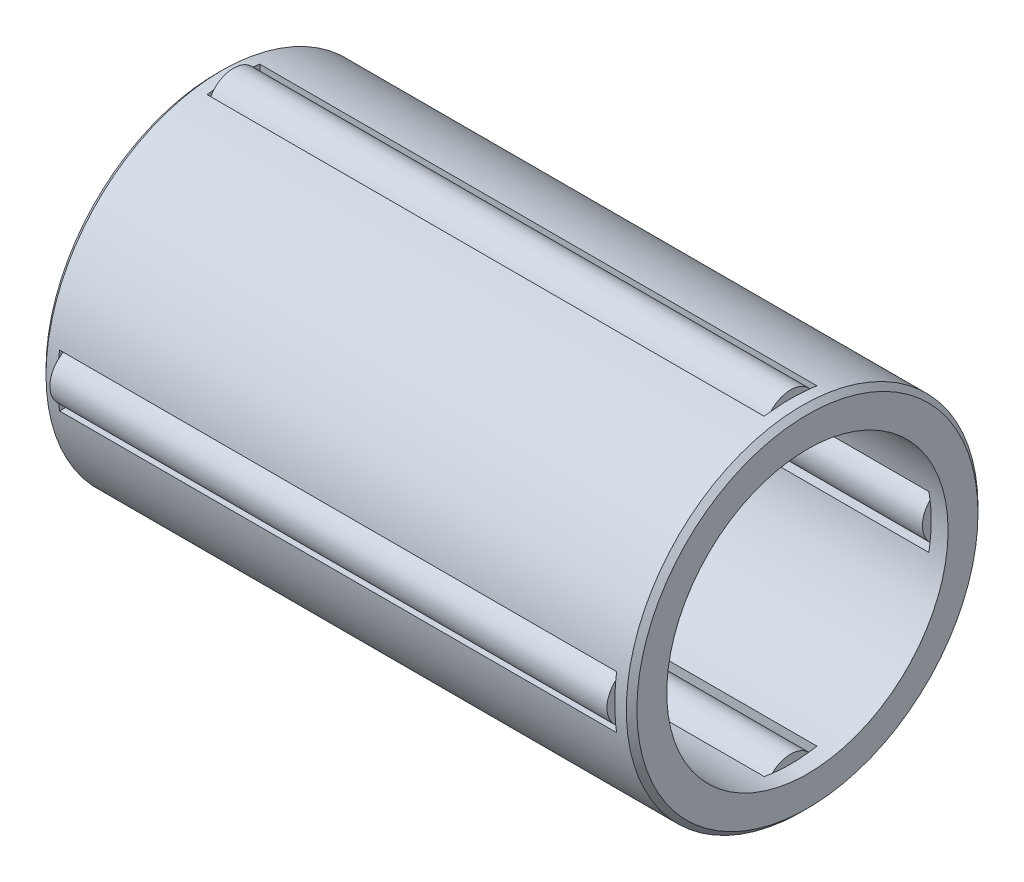
ISO-10303-21;
HEADER;
FILE_DESCRIPTION(('STEP AP214'),'2;1');
FILE_NAME('part.step','',(''),(''),'','','');
FILE_SCHEMA(('AUTOMOTIVE_DESIGN { 1 0 10303 214 1 1 1 1 }'));
ENDSEC;
DATA;
#1=APPLICATION_CONTEXT('core data for automotive mechanical design processes');
#2=APPLICATION_PROTOCOL_DEFINITION('international standard','automotive_design',2000,#1);
#3=PRODUCT_CONTEXT('',#1,'mechanical');
#4=PRODUCT('Part','Part','',(#3));
#5=PRODUCT_RELATED_PRODUCT_CATEGORY('part','',(#4));
#6=PRODUCT_DEFINITION_FORMATION('','',#4);
#7=PRODUCT_DEFINITION_CONTEXT('part definition',#1,'design');
#8=PRODUCT_DEFINITION('design','',#6,#7);
#9=PRODUCT_DEFINITION_SHAPE('','',#8);
#10=(LENGTH_UNIT() NAMED_UNIT(*) SI_UNIT(.MILLI.,.METRE.));
#11=(NAMED_UNIT(*) PLANE_ANGLE_UNIT() SI_UNIT($,.RADIAN.));
#12=(NAMED_UNIT(*) SI_UNIT($,.STERADIAN.) SOLID_ANGLE_UNIT());
#13=UNCERTAINTY_MEASURE_WITH_UNIT(LENGTH_MEASURE(1.E-05),#10,'distance_accuracy_value','');
#14=(GEOMETRIC_REPRESENTATION_CONTEXT(3) GLOBAL_UNCERTAINTY_ASSIGNED_CONTEXT((#13)) GLOBAL_UNIT_ASSIGNED_CONTEXT((#10,
#11,#12)) REPRESENTATION_CONTEXT('',''));
#15=CARTESIAN_POINT('',(0.,0.,0.));
#16=DIRECTION('',(0.,0.,1.));
#17=DIRECTION('',(1.,0.,0.));
#18=AXIS2_PLACEMENT_3D('',#15,#16,#17);
#19=CARTESIAN_POINT('',(1.6,13.33335,0.));
#20=DIRECTION('',(1.,0.,0.));
#21=DIRECTION('',(0.,0.,-1.));
#22=AXIS2_PLACEMENT_3D('',#19,#20,#21);
#23=PLANE('',#22);
#24=CARTESIAN_POINT('',(1.6,0.,0.));
#25=DIRECTION('',(1.,0.,0.));
#26=DIRECTION('',(0.,0.,-1.));
#27=AXIS2_PLACEMENT_3D('',#24,#25,#26);
#28=CIRCLE('',#27,16.66665);
#29=CARTESIAN_POINT('',(1.6,-2.5,-16.4780830870129));
#30=VERTEX_POINT('',#29);
#31=CARTESIAN_POINT('',(1.6,-1.84283291133947,-16.5644555927258));
#32=VERTEX_POINT('',#31);
#33=EDGE_CURVE('E264',#30,#32,#28,.T.);
#34=ORIENTED_EDGE('',*,*,#33,.T.);
#35=CARTESIAN_POINT('',(1.6,1.56592938047115E-13,-14.95));
#36=DIRECTION('',(1.,0.,0.));
#37=DIRECTION('',(0.,-1.,0.));
#38=AXIS2_PLACEMENT_3D('',#35,#36,#37);
#39=CIRCLE('',#38,2.45);
#40=CARTESIAN_POINT('',(1.6,-1.7348272868859,-13.2200074321907));
#41=VERTEX_POINT('',#40);
#42=EDGE_CURVE('E242',#41,#32,#39,.T.);
#43=ORIENTED_EDGE('',*,*,#42,.F.);
#44=CARTESIAN_POINT('',(1.6,0.,0.));
#45=DIRECTION('',(1.,0.,0.));
#46=DIRECTION('',(0.,0.,-1.));
#47=AXIS2_PLACEMENT_3D('',#44,#45,#46);
#48=CIRCLE('',#47,13.33335);
#49=CARTESIAN_POINT('',(1.6,-2.5,-13.0968783388447));
#50=VERTEX_POINT('',#49);
#51=EDGE_CURVE('E308',#50,#41,#48,.T.);
#52=ORIENTED_EDGE('',*,*,#51,.F.);
#53=DIRECTION('',(0.,0.,1.));
#54=VECTOR('',#53,1.);
#55=CARTESIAN_POINT('',(1.6,-2.5,-13.0968783388447));
#56=LINE('',#55,#54);
#57=EDGE_CURVE('E272',#30,#50,#56,.T.);
#58=ORIENTED_EDGE('',*,*,#57,.F.);
#59=EDGE_LOOP('',(#34,#43,#52,#58));
#60=FACE_BOUND('',#59,.T.);
#61=ADVANCED_FACE('F33',(#60),#23,.T.);
#62=CARTESIAN_POINT('',(54.4,0.,0.));
#63=DIRECTION('',(1.,0.,0.));
#64=DIRECTION('',(0.,0.,-1.));
#65=AXIS2_PLACEMENT_3D('',#62,#63,#64);
#66=PLANE('',#65);
#67=CARTESIAN_POINT('',(54.4,1.56592938047115E-13,-14.95));
#68=DIRECTION('',(1.,0.,0.));
#69=DIRECTION('',(0.,0.,-1.));
#70=AXIS2_PLACEMENT_3D('',#67,#68,#69);
#71=CIRCLE('',#70,2.45);
#72=CARTESIAN_POINT('',(54.4,-1.84283291133948,-16.5644555927258));
#73=VERTEX_POINT('',#72);
#74=CARTESIAN_POINT('',(54.4,-1.7348272868859,-13.2200074321907));
#75=VERTEX_POINT('',#74);
#76=EDGE_CURVE('E56',#73,#75,#71,.F.);
#77=ORIENTED_EDGE('',*,*,#76,.F.);
#78=CARTESIAN_POINT('',(54.4,0.,0.));
#79=DIRECTION('',(-1.,0.,0.));
#80=DIRECTION('',(0.,0.,-1.));
#81=AXIS2_PLACEMENT_3D('',#78,#79,#80);
#82=CIRCLE('',#81,16.66665);
#83=CARTESIAN_POINT('',(54.4,-2.5,-16.4780830870129));
#84=VERTEX_POINT('',#83);
#85=EDGE_CURVE('E513',#73,#84,#82,.T.);
#86=ORIENTED_EDGE('',*,*,#85,.T.);
#87=DIRECTION('',(0.,0.,1.));
#88=VECTOR('',#87,1.);
#89=CARTESIAN_POINT('',(54.4,-2.5,-13.0968783388447));
#90=LINE('',#89,#88);
#91=CARTESIAN_POINT('',(54.4,-2.5,-13.0968783388447));
#92=VERTEX_POINT('',#91);
#93=EDGE_CURVE('E1062',#84,#92,#90,.T.);
#94=ORIENTED_EDGE('',*,*,#93,.T.);
#95=CARTESIAN_POINT('',(54.4,0.,0.));
#96=DIRECTION('',(-1.,0.,0.));
#97=DIRECTION('',(0.,0.,-1.));
#98=AXIS2_PLACEMENT_3D('',#95,#96,#97);
#99=CIRCLE('',#98,13.33335);
#100=EDGE_CURVE('E531',#75,#92,#99,.T.);
#101=ORIENTED_EDGE('',*,*,#100,.F.);
#102=EDGE_LOOP('',(#77,#86,#94,#101));
#103=FACE_BOUND('',#102,.T.);
#104=ADVANCED_FACE('F558',(#103),#66,.F.);
#105=CARTESIAN_POINT('',(1.6,-16.4780830870129,2.5));
#106=VERTEX_POINT('',#105);
#107=CARTESIAN_POINT('',(1.6,-16.5644555927258,1.84283291133965));
#108=VERTEX_POINT('',#107);
#109=EDGE_CURVE('E275',#106,#108,#28,.T.);
#110=ORIENTED_EDGE('',*,*,#109,.T.);
#111=CARTESIAN_POINT('',(1.6,-14.95,0.));
#112=DIRECTION('',(1.,0.,0.));
#113=DIRECTION('',(0.,0.,1.));
#114=AXIS2_PLACEMENT_3D('',#111,#112,#113);
#115=CIRCLE('',#114,2.45);
#116=CARTESIAN_POINT('',(1.6,-13.2200074321906,1.73482728688604));
#117=VERTEX_POINT('',#116);
#118=EDGE_CURVE('E267',#117,#108,#115,.T.);
#119=ORIENTED_EDGE('',*,*,#118,.F.);
#120=CARTESIAN_POINT('',(1.6,-13.0968783388447,2.5));
#121=VERTEX_POINT('',#120);
#122=EDGE_CURVE('E317',#121,#117,#48,.T.);
#123=ORIENTED_EDGE('',*,*,#122,.F.);
#124=DIRECTION('',(0.,1.,0.));
#125=VECTOR('',#124,1.);
#126=CARTESIAN_POINT('',(1.6,-13.0968783388447,2.5));
#127=LINE('',#126,#125);
#128=EDGE_CURVE('E650',#106,#121,#127,.T.);
#129=ORIENTED_EDGE('',*,*,#128,.F.);
#130=EDGE_LOOP('',(#110,#119,#123,#129));
#131=FACE_BOUND('',#130,.T.);
#132=ADVANCED_FACE('F560',(#131),#23,.T.);
#133=CARTESIAN_POINT('',(54.4,-14.95,0.));
#134=DIRECTION('',(1.,0.,0.));
#135=DIRECTION('',(0.,0.,-1.));
#136=AXIS2_PLACEMENT_3D('',#133,#134,#135);
#137=CIRCLE('',#136,2.45);
#138=CARTESIAN_POINT('',(54.4,-16.5644555927258,1.84283291133965));
#139=VERTEX_POINT('',#138);
#140=CARTESIAN_POINT('',(54.4,-13.2200074321906,1.73482728688603));
#141=VERTEX_POINT('',#140);
#142=EDGE_CURVE('E410',#139,#141,#137,.F.);
#143=ORIENTED_EDGE('',*,*,#142,.F.);
#144=CARTESIAN_POINT('',(54.4,-16.4780830870129,2.5));
#145=VERTEX_POINT('',#144);
#146=EDGE_CURVE('E446',#139,#145,#82,.T.);
#147=ORIENTED_EDGE('',*,*,#146,.T.);
#148=DIRECTION('',(0.,1.,0.));
#149=VECTOR('',#148,1.);
#150=CARTESIAN_POINT('',(54.4,-13.0968783388447,2.5));
#151=LINE('',#150,#149);
#152=CARTESIAN_POINT('',(54.4,-13.0968783388447,2.5));
#153=VERTEX_POINT('',#152);
#154=EDGE_CURVE('E642',#145,#153,#151,.T.);
#155=ORIENTED_EDGE('',*,*,#154,.T.);
#156=EDGE_CURVE('E536',#141,#153,#99,.T.);
#157=ORIENTED_EDGE('',*,*,#156,.F.);
#158=EDGE_LOOP('',(#143,#147,#155,#157));
#159=FACE_BOUND('',#158,.T.);
#160=ADVANCED_FACE('F565',(#159),#66,.F.);
#161=CARTESIAN_POINT('',(1.6,-1.73482728688608,13.2200074321906));
#162=VERTEX_POINT('',#161);
#163=CARTESIAN_POINT('',(1.6,-2.5,13.0968783388447));
#164=VERTEX_POINT('',#163);
#165=EDGE_CURVE('E312',#162,#164,#48,.T.);
#166=ORIENTED_EDGE('',*,*,#165,.F.);
#167=CARTESIAN_POINT('',(1.6,0.,14.95));
#168=DIRECTION('',(1.,0.,0.));
#169=DIRECTION('',(0.,1.,0.));
#170=AXIS2_PLACEMENT_3D('',#167,#168,#169);
#171=CIRCLE('',#170,2.45);
#172=CARTESIAN_POINT('',(1.6,-1.8428329113397,16.5644555927257));
#173=VERTEX_POINT('',#172);
#174=EDGE_CURVE('E613',#173,#162,#171,.T.);
#175=ORIENTED_EDGE('',*,*,#174,.F.);
#176=CARTESIAN_POINT('',(1.6,-2.5,16.4780830870129));
#177=VERTEX_POINT('',#176);
#178=EDGE_CURVE('E277',#173,#177,#28,.T.);
#179=ORIENTED_EDGE('',*,*,#178,.T.);
#180=DIRECTION('',(0.,0.,1.));
#181=VECTOR('',#180,1.);
#182=CARTESIAN_POINT('',(1.6,-2.5,16.4780830870129));
#183=LINE('',#182,#181);
#184=EDGE_CURVE('E646',#164,#177,#183,.T.);
#185=ORIENTED_EDGE('',*,*,#184,.F.);
#186=EDGE_LOOP('',(#166,#175,#179,#185));
#187=FACE_BOUND('',#186,.T.);
#188=ADVANCED_FACE('F570',(#187),#23,.T.);
#189=CARTESIAN_POINT('',(54.4,0.,14.95));
#190=DIRECTION('',(1.,0.,0.));
#191=DIRECTION('',(0.,0.,-1.));
#192=AXIS2_PLACEMENT_3D('',#189,#190,#191);
#193=CIRCLE('',#192,2.45);
#194=CARTESIAN_POINT('',(54.4,-1.73482728688608,13.2200074321906));
#195=VERTEX_POINT('',#194);
#196=CARTESIAN_POINT('',(54.4,-1.84283291133971,16.5644555927257));
#197=VERTEX_POINT('',#196);
#198=EDGE_CURVE('E402',#195,#197,#193,.F.);
#199=ORIENTED_EDGE('',*,*,#198,.F.);
#200=CARTESIAN_POINT('',(54.4,-2.5,13.0968783388447));
#201=VERTEX_POINT('',#200);
#202=EDGE_CURVE('E388',#201,#195,#99,.T.);
#203=ORIENTED_EDGE('',*,*,#202,.F.);
#204=DIRECTION('',(0.,0.,1.));
#205=VECTOR('',#204,1.);
#206=CARTESIAN_POINT('',(54.4,-2.5,16.4780830870129));
#207=LINE('',#206,#205);
#208=CARTESIAN_POINT('',(54.4,-2.5,16.4780830870129));
#209=VERTEX_POINT('',#208);
#210=EDGE_CURVE('E639',#201,#209,#207,.T.);
#211=ORIENTED_EDGE('',*,*,#210,.T.);
#212=EDGE_CURVE('E493',#209,#197,#82,.T.);
#213=ORIENTED_EDGE('',*,*,#212,.T.);
#214=EDGE_LOOP('',(#199,#203,#211,#213));
#215=FACE_BOUND('',#214,.T.);
#216=ADVANCED_FACE('F638',(#215),#66,.F.);
#217=CARTESIAN_POINT('',(1.6,13.2200074321906,1.73482728688604));
#218=VERTEX_POINT('',#217);
#219=CARTESIAN_POINT('',(1.6,13.0968783388447,2.5));
#220=VERTEX_POINT('',#219);
#221=EDGE_CURVE('E298',#218,#220,#48,.T.);
#222=ORIENTED_EDGE('',*,*,#221,.F.);
#223=CARTESIAN_POINT('',(1.6,14.95,0.));
#224=DIRECTION('',(1.,0.,0.));
#225=DIRECTION('',(0.,0.,-1.));
#226=AXIS2_PLACEMENT_3D('',#223,#224,#225);
#227=CIRCLE('',#226,2.45);
#228=CARTESIAN_POINT('',(1.6,16.5644555927258,1.84283291133965));
#229=VERTEX_POINT('',#228);
#230=EDGE_CURVE('E355',#229,#218,#227,.T.);
#231=ORIENTED_EDGE('',*,*,#230,.F.);
#232=CARTESIAN_POINT('',(1.6,16.4780830870129,2.5));
#233=VERTEX_POINT('',#232);
#234=EDGE_CURVE('E276',#229,#233,#28,.T.);
#235=ORIENTED_EDGE('',*,*,#234,.T.);
#236=DIRECTION('',(0.,1.,0.));
#237=VECTOR('',#236,1.);
#238=CARTESIAN_POINT('',(1.6,16.4780830870129,2.5));
#239=LINE('',#238,#237);
#240=EDGE_CURVE('E369',#220,#233,#239,.T.);
#241=ORIENTED_EDGE('',*,*,#240,.F.);
#242=EDGE_LOOP('',(#222,#231,#235,#241));
#243=FACE_BOUND('',#242,.T.);
#244=ADVANCED_FACE('F368',(#243),#23,.T.);
#245=CARTESIAN_POINT('',(54.4,14.95,0.));
#246=DIRECTION('',(1.,0.,0.));
#247=DIRECTION('',(0.,0.,-1.));
#248=AXIS2_PLACEMENT_3D('',#245,#246,#247);
#249=CIRCLE('',#248,2.45);
#250=CARTESIAN_POINT('',(54.4,13.2200074321906,1.73482728688603));
#251=VERTEX_POINT('',#250);
#252=CARTESIAN_POINT('',(54.4,16.5644555927258,1.84283291133965));
#253=VERTEX_POINT('',#252);
#254=EDGE_CURVE('E396',#251,#253,#249,.F.);
#255=ORIENTED_EDGE('',*,*,#254,.F.);
#256=CARTESIAN_POINT('',(54.4,13.0968783388447,2.5));
#257=VERTEX_POINT('',#256);
#258=EDGE_CURVE('E381',#257,#251,#99,.T.);
#259=ORIENTED_EDGE('',*,*,#258,.F.);
#260=DIRECTION('',(0.,1.,0.));
#261=VECTOR('',#260,1.);
#262=CARTESIAN_POINT('',(54.4,16.4780830870129,2.5));
#263=LINE('',#262,#261);
#264=CARTESIAN_POINT('',(54.4,16.4780830870129,2.5));
#265=VERTEX_POINT('',#264);
#266=EDGE_CURVE('E378',#257,#265,#263,.T.);
#267=ORIENTED_EDGE('',*,*,#266,.T.);
#268=EDGE_CURVE('E488',#265,#253,#82,.T.);
#269=ORIENTED_EDGE('',*,*,#268,.T.);
#270=EDGE_LOOP('',(#255,#259,#267,#269));
#271=FACE_BOUND('',#270,.T.);
#272=ADVANCED_FACE('F489',(#271),#66,.F.);
#273=CARTESIAN_POINT('',(1.6,-13.2200074321906,-1.73482728688604));
#274=VERTEX_POINT('',#273);
#275=CARTESIAN_POINT('',(1.6,-13.0968783388447,-2.5));
#276=VERTEX_POINT('',#275);
#277=EDGE_CURVE('E324',#274,#276,#48,.T.);
#278=ORIENTED_EDGE('',*,*,#277,.F.);
#279=CARTESIAN_POINT('',(1.6,-16.5644555927258,-1.84283291133965));
#280=VERTEX_POINT('',#279);
#281=EDGE_CURVE('E602',#280,#274,#115,.T.);
#282=ORIENTED_EDGE('',*,*,#281,.F.);
#283=CARTESIAN_POINT('',(1.6,-16.4780830870129,-2.5));
#284=VERTEX_POINT('',#283);
#285=EDGE_CURVE('E273',#280,#284,#28,.T.);
#286=ORIENTED_EDGE('',*,*,#285,.T.);
#287=DIRECTION('',(0.,-1.,0.));
#288=VECTOR('',#287,1.);
#289=CARTESIAN_POINT('',(1.6,-16.4780830870129,-2.5));
#290=LINE('',#289,#288);
#291=EDGE_CURVE('E507',#276,#284,#290,.T.);
#292=ORIENTED_EDGE('',*,*,#291,.F.);
#293=EDGE_LOOP('',(#278,#282,#286,#292));
#294=FACE_BOUND('',#293,.T.);
#295=ADVANCED_FACE('F581',(#294),#23,.T.);
#296=CARTESIAN_POINT('',(1.6,1.73482728688617,-13.2200074321906));
#297=VERTEX_POINT('',#296);
#298=CARTESIAN_POINT('',(1.6,2.5,-13.0968783388447));
#299=VERTEX_POINT('',#298);
#300=EDGE_CURVE('E316',#297,#299,#48,.T.);
#301=ORIENTED_EDGE('',*,*,#300,.F.);
#302=CARTESIAN_POINT('',(1.6,1.84283291133982,-16.5644555927257));
#303=VERTEX_POINT('',#302);
#304=EDGE_CURVE('E48',#303,#297,#39,.T.);
#305=ORIENTED_EDGE('',*,*,#304,.F.);
#306=CARTESIAN_POINT('',(1.6,2.5,-16.4780830870129));
#307=VERTEX_POINT('',#306);
#308=EDGE_CURVE('E266',#303,#307,#28,.T.);
#309=ORIENTED_EDGE('',*,*,#308,.T.);
#310=DIRECTION('',(0.,0.,-1.));
#311=VECTOR('',#310,1.);
#312=CARTESIAN_POINT('',(1.6,2.5,-16.4780830870129));
#313=LINE('',#312,#311);
#314=EDGE_CURVE('E455',#299,#307,#313,.T.);
#315=ORIENTED_EDGE('',*,*,#314,.F.);
#316=EDGE_LOOP('',(#301,#305,#309,#315));
#317=FACE_BOUND('',#316,.T.);
#318=ADVANCED_FACE('F577',(#317),#23,.T.);
#319=CARTESIAN_POINT('',(1.6,2.5,16.4780830870129));
#320=VERTEX_POINT('',#319);
#321=CARTESIAN_POINT('',(1.6,1.84283291133959,16.5644555927258));
#322=VERTEX_POINT('',#321);
#323=EDGE_CURVE('E279',#320,#322,#28,.T.);
#324=ORIENTED_EDGE('',*,*,#323,.T.);
#325=CARTESIAN_POINT('',(1.6,1.73482728688599,13.2200074321906));
#326=VERTEX_POINT('',#325);
#327=EDGE_CURVE('E608',#326,#322,#171,.T.);
#328=ORIENTED_EDGE('',*,*,#327,.F.);
#329=CARTESIAN_POINT('',(1.6,2.5,13.0968783388447));
#330=VERTEX_POINT('',#329);
#331=EDGE_CURVE('E309',#330,#326,#48,.T.);
#332=ORIENTED_EDGE('',*,*,#331,.F.);
#333=DIRECTION('',(0.,0.,-1.));
#334=VECTOR('',#333,1.);
#335=CARTESIAN_POINT('',(1.6,2.5,13.0968783388447));
#336=LINE('',#335,#334);
#337=EDGE_CURVE('E372',#320,#330,#336,.T.);
#338=ORIENTED_EDGE('',*,*,#337,.F.);
#339=EDGE_LOOP('',(#324,#328,#332,#338));
#340=FACE_BOUND('',#339,.T.);
#341=ADVANCED_FACE('F572',(#340),#23,.T.);
#342=CARTESIAN_POINT('',(1.6,16.4780830870129,-2.5));
#343=VERTEX_POINT('',#342);
#344=CARTESIAN_POINT('',(1.6,16.5644555927258,-1.84283291133965));
#345=VERTEX_POINT('',#344);
#346=EDGE_CURVE('E278',#343,#345,#28,.T.);
#347=ORIENTED_EDGE('',*,*,#346,.T.);
#348=CARTESIAN_POINT('',(1.6,13.2200074321906,-1.73482728688604));
#349=VERTEX_POINT('',#348);
#350=EDGE_CURVE('E346',#349,#345,#227,.T.);
#351=ORIENTED_EDGE('',*,*,#350,.F.);
#352=CARTESIAN_POINT('',(1.6,13.0968783388447,-2.5));
#353=VERTEX_POINT('',#352);
#354=EDGE_CURVE('E307',#353,#349,#48,.T.);
#355=ORIENTED_EDGE('',*,*,#354,.F.);
#356=DIRECTION('',(0.,-1.,0.));
#357=VECTOR('',#356,1.);
#358=CARTESIAN_POINT('',(1.6,13.0968783388447,-2.5));
#359=LINE('',#358,#357);
#360=EDGE_CURVE('E344',#343,#353,#359,.T.);
#361=ORIENTED_EDGE('',*,*,#360,.F.);
#362=EDGE_LOOP('',(#347,#351,#355,#361));
#363=FACE_BOUND('',#362,.T.);
#364=ADVANCED_FACE('F343',(#363),#23,.T.);
#365=CARTESIAN_POINT('',(0.,0.,0.));
#366=DIRECTION('',(1.,0.,0.));
#367=DIRECTION('',(0.,0.,-1.));
#368=AXIS2_PLACEMENT_3D('',#365,#366,#367);
#369=CYLINDRICAL_SURFACE('',#368,16.66665);
#370=CARTESIAN_POINT('',(0.500000000000007,0.,0.));
#371=DIRECTION('',(-1.,0.,0.));
#372=DIRECTION('',(0.,0.,1.));
#373=AXIS2_PLACEMENT_3D('',#370,#371,#372);
#374=CIRCLE('',#373,16.66665);
#375=CARTESIAN_POINT('',(0.500000000000007,0.,16.66665));
#376=VERTEX_POINT('',#375);
#377=EDGE_CURVE('E415',#376,#376,#374,.F.);
#378=ORIENTED_EDGE('',*,*,#377,.T.);
#379=EDGE_LOOP('',(#378));
#380=FACE_BOUND('',#379,.T.);
#381=CARTESIAN_POINT('',(55.5,0.,0.));
#382=DIRECTION('',(1.,0.,0.));
#383=DIRECTION('',(0.,0.,-1.));
#384=AXIS2_PLACEMENT_3D('',#381,#382,#383);
#385=CIRCLE('',#384,16.66665);
#386=CARTESIAN_POINT('',(55.5,0.,-16.66665));
#387=VERTEX_POINT('',#386);
#388=EDGE_CURVE('E412',#387,#387,#385,.F.);
#389=ORIENTED_EDGE('',*,*,#388,.T.);
#390=EDGE_LOOP('',(#389));
#391=FACE_BOUND('',#390,.T.);
#392=DIRECTION('',(-1.,0.,0.));
#393=VECTOR('',#392,1.);
#394=CARTESIAN_POINT('',(54.4,2.5,16.4780830870129));
#395=LINE('',#394,#393);
#396=CARTESIAN_POINT('',(54.4,2.5,16.4780830870129));
#397=VERTEX_POINT('',#396);
#398=EDGE_CURVE('E437',#397,#320,#395,.T.);
#399=ORIENTED_EDGE('',*,*,#398,.F.);
#400=CARTESIAN_POINT('',(54.4,1.84283291133959,16.5644555927258));
#401=VERTEX_POINT('',#400);
#402=EDGE_CURVE('E490',#401,#397,#82,.T.);
#403=ORIENTED_EDGE('',*,*,#402,.F.);
#404=EDGE_CURVE('E494',#197,#401,#82,.T.);
#405=ORIENTED_EDGE('',*,*,#404,.F.);
#406=ORIENTED_EDGE('',*,*,#212,.F.);
#407=DIRECTION('',(-1.,0.,0.));
#408=VECTOR('',#407,1.);
#409=CARTESIAN_POINT('',(54.4,-2.5,16.4780830870129));
#410=LINE('',#409,#408);
#411=EDGE_CURVE('E641',#209,#177,#410,.T.);
#412=ORIENTED_EDGE('',*,*,#411,.T.);
#413=ORIENTED_EDGE('',*,*,#178,.F.);
#414=CARTESIAN_POINT('',(1.6,0.,0.));
#415=DIRECTION('',(1.,0.,0.));
#416=DIRECTION('',(0.,0.,-1.));
#417=AXIS2_PLACEMENT_3D('',#414,#415,#416);
#418=CIRCLE('',#417,16.66665);
#419=EDGE_CURVE('E352',#173,#322,#418,.F.);
#420=ORIENTED_EDGE('',*,*,#419,.T.);
#421=ORIENTED_EDGE('',*,*,#323,.F.);
#422=EDGE_LOOP('',(#399,#403,#405,#406,#412,#413,#420,#421));
#423=FACE_BOUND('',#422,.T.);
#424=DIRECTION('',(-1.,0.,0.));
#425=VECTOR('',#424,1.);
#426=CARTESIAN_POINT('',(54.4,16.4780830870129,-2.5));
#427=LINE('',#426,#425);
#428=CARTESIAN_POINT('',(54.4,16.4780830870129,-2.5));
#429=VERTEX_POINT('',#428);
#430=EDGE_CURVE('E373',#429,#343,#427,.T.);
#431=ORIENTED_EDGE('',*,*,#430,.F.);
#432=CARTESIAN_POINT('',(54.4,16.5644555927258,-1.84283291133965));
#433=VERTEX_POINT('',#432);
#434=EDGE_CURVE('E497',#433,#429,#82,.T.);
#435=ORIENTED_EDGE('',*,*,#434,.F.);
#436=EDGE_CURVE('E491',#253,#433,#82,.T.);
#437=ORIENTED_EDGE('',*,*,#436,.F.);
#438=ORIENTED_EDGE('',*,*,#268,.F.);
#439=DIRECTION('',(-1.,0.,0.));
#440=VECTOR('',#439,1.);
#441=CARTESIAN_POINT('',(54.4,16.4780830870129,2.5));
#442=LINE('',#441,#440);
#443=EDGE_CURVE('E291',#265,#233,#442,.T.);
#444=ORIENTED_EDGE('',*,*,#443,.T.);
#445=ORIENTED_EDGE('',*,*,#234,.F.);
#446=CARTESIAN_POINT('',(1.6,0.,0.));
#447=DIRECTION('',(1.,0.,0.));
#448=DIRECTION('',(0.,0.,-1.));
#449=AXIS2_PLACEMENT_3D('',#446,#447,#448);
#450=CIRCLE('',#449,16.66665);
#451=EDGE_CURVE('E528',#229,#345,#450,.F.);
#452=ORIENTED_EDGE('',*,*,#451,.T.);
#453=ORIENTED_EDGE('',*,*,#346,.F.);
#454=EDGE_LOOP('',(#431,#435,#437,#438,#444,#445,#452,#453));
#455=FACE_BOUND('',#454,.T.);
#456=DIRECTION('',(-1.,0.,0.));
#457=VECTOR('',#456,1.);
#458=CARTESIAN_POINT('',(54.4,-16.4780830870129,2.5));
#459=LINE('',#458,#457);
#460=EDGE_CURVE('E444',#145,#106,#459,.T.);
#461=ORIENTED_EDGE('',*,*,#460,.F.);
#462=ORIENTED_EDGE('',*,*,#146,.F.);
#463=CARTESIAN_POINT('',(54.4,-16.5644555927257,-1.84283291133965));
#464=VERTEX_POINT('',#463);
#465=EDGE_CURVE('E495',#464,#139,#82,.T.);
#466=ORIENTED_EDGE('',*,*,#465,.F.);
#467=CARTESIAN_POINT('',(54.4,-16.4780830870129,-2.5));
#468=VERTEX_POINT('',#467);
#469=EDGE_CURVE('E501',#468,#464,#82,.T.);
#470=ORIENTED_EDGE('',*,*,#469,.F.);
#471=DIRECTION('',(-1.,0.,0.));
#472=VECTOR('',#471,1.);
#473=CARTESIAN_POINT('',(54.4,-16.4780830870129,-2.5));
#474=LINE('',#473,#472);
#475=EDGE_CURVE('E1054',#468,#284,#474,.T.);
#476=ORIENTED_EDGE('',*,*,#475,.T.);
#477=ORIENTED_EDGE('',*,*,#285,.F.);
#478=CARTESIAN_POINT('',(1.6,0.,0.));
#479=DIRECTION('',(1.,0.,0.));
#480=DIRECTION('',(0.,0.,-1.));
#481=AXIS2_PLACEMENT_3D('',#478,#479,#480);
#482=CIRCLE('',#481,16.66665);
#483=EDGE_CURVE('E606',#280,#108,#482,.F.);
#484=ORIENTED_EDGE('',*,*,#483,.T.);
#485=ORIENTED_EDGE('',*,*,#109,.F.);
#486=EDGE_LOOP('',(#461,#462,#466,#470,#476,#477,#484,#485));
#487=FACE_BOUND('',#486,.T.);
#488=CARTESIAN_POINT('',(54.4,2.5,-16.4780830870129));
#489=VERTEX_POINT('',#488);
#490=CARTESIAN_POINT('',(54.4,1.84283291133982,-16.5644555927257));
#491=VERTEX_POINT('',#490);
#492=EDGE_CURVE('E498',#489,#491,#82,.T.);
#493=ORIENTED_EDGE('',*,*,#492,.F.);
#494=DIRECTION('',(-1.,0.,0.));
#495=VECTOR('',#494,1.);
#496=CARTESIAN_POINT('',(54.4,2.5,-16.4780830870129));
#497=LINE('',#496,#495);
#498=EDGE_CURVE('E466',#489,#307,#497,.T.);
#499=ORIENTED_EDGE('',*,*,#498,.T.);
#500=ORIENTED_EDGE('',*,*,#308,.F.);
#501=CARTESIAN_POINT('',(1.6,0.,0.));
#502=DIRECTION('',(1.,0.,0.));
#503=DIRECTION('',(0.,0.,-1.));
#504=AXIS2_PLACEMENT_3D('',#501,#502,#503);
#505=CIRCLE('',#504,16.66665);
#506=EDGE_CURVE('E256',#303,#32,#505,.F.);
#507=ORIENTED_EDGE('',*,*,#506,.T.);
#508=ORIENTED_EDGE('',*,*,#33,.F.);
#509=DIRECTION('',(-1.,0.,0.));
#510=VECTOR('',#509,1.);
#511=CARTESIAN_POINT('',(54.4,-2.5,-16.4780830870129));
#512=LINE('',#511,#510);
#513=EDGE_CURVE('E1056',#84,#30,#512,.T.);
#514=ORIENTED_EDGE('',*,*,#513,.F.);
#515=ORIENTED_EDGE('',*,*,#85,.F.);
#516=EDGE_CURVE('E505',#491,#73,#82,.T.);
#517=ORIENTED_EDGE('',*,*,#516,.F.);
#518=EDGE_LOOP('',(#493,#499,#500,#507,#508,#514,#515,#517));
#519=FACE_BOUND('',#518,.T.);
#520=ADVANCED_FACE('F262',(#380,#391,#423,#455,#487,#519),#369,.T.);
#521=CARTESIAN_POINT('',(0.,16.66665,0.));
#522=DIRECTION('',(-1.,0.,0.));
#523=DIRECTION('',(0.,0.,1.));
#524=AXIS2_PLACEMENT_3D('',#521,#522,#523);
#525=PLANE('',#524);
#526=CARTESIAN_POINT('',(0.,0.,0.));
#527=DIRECTION('',(-1.,0.,0.));
#528=DIRECTION('',(0.,0.,1.));
#529=AXIS2_PLACEMENT_3D('',#526,#527,#528);
#530=CIRCLE('',#529,16.16665);
#531=CARTESIAN_POINT('',(0.,0.,16.16665));
#532=VERTEX_POINT('',#531);
#533=EDGE_CURVE('E41',#532,#532,#530,.T.);
#534=ORIENTED_EDGE('',*,*,#533,.T.);
#535=EDGE_LOOP('',(#534));
#536=FACE_BOUND('',#535,.T.);
#537=CARTESIAN_POINT('',(0.,0.,0.));
#538=DIRECTION('',(1.,0.,0.));
#539=DIRECTION('',(0.,0.,-1.));
#540=AXIS2_PLACEMENT_3D('',#537,#538,#539);
#541=CIRCLE('',#540,13.33335);
#542=CARTESIAN_POINT('',(0.,0.,-13.33335));
#543=VERTEX_POINT('',#542);
#544=EDGE_CURVE('E315',#543,#543,#541,.T.);
#545=ORIENTED_EDGE('',*,*,#544,.T.);
#546=EDGE_LOOP('',(#545));
#547=FACE_BOUND('',#546,.T.);
#548=ADVANCED_FACE('F420',(#536,#547),#525,.T.);
#549=CARTESIAN_POINT('',(0.,0.,0.));
#550=DIRECTION('',(1.,0.,0.));
#551=DIRECTION('',(0.,0.,-1.));
#552=AXIS2_PLACEMENT_3D('',#549,#550,#551);
#553=CYLINDRICAL_SURFACE('',#552,13.33335);
#554=DIRECTION('',(-1.,0.,0.));
#555=VECTOR('',#554,1.);
#556=CARTESIAN_POINT('',(54.4,13.0968783388447,2.5));
#557=LINE('',#556,#555);
#558=EDGE_CURVE('E283',#257,#220,#557,.T.);
#559=ORIENTED_EDGE('',*,*,#558,.F.);
#560=ORIENTED_EDGE('',*,*,#258,.T.);
#561=CARTESIAN_POINT('',(54.4,13.2200074321906,-1.73482728688603));
#562=VERTEX_POINT('',#561);
#563=EDGE_CURVE('E383',#251,#562,#99,.T.);
#564=ORIENTED_EDGE('',*,*,#563,.T.);
#565=CARTESIAN_POINT('',(54.4,13.0968783388447,-2.5));
#566=VERTEX_POINT('',#565);
#567=EDGE_CURVE('E392',#562,#566,#99,.T.);
#568=ORIENTED_EDGE('',*,*,#567,.T.);
#569=DIRECTION('',(-1.,0.,0.));
#570=VECTOR('',#569,1.);
#571=CARTESIAN_POINT('',(54.4,13.0968783388447,-2.5));
#572=LINE('',#571,#570);
#573=EDGE_CURVE('E339',#566,#353,#572,.T.);
#574=ORIENTED_EDGE('',*,*,#573,.T.);
#575=ORIENTED_EDGE('',*,*,#354,.T.);
#576=EDGE_CURVE('E302',#349,#218,#48,.T.);
#577=ORIENTED_EDGE('',*,*,#576,.T.);
#578=ORIENTED_EDGE('',*,*,#221,.T.);
#579=EDGE_LOOP('',(#559,#560,#564,#568,#574,#575,#577,#578));
#580=FACE_BOUND('',#579,.T.);
#581=DIRECTION('',(-1.,0.,0.));
#582=VECTOR('',#581,1.);
#583=CARTESIAN_POINT('',(54.4,2.5,-13.0968783388447));
#584=LINE('',#583,#582);
#585=CARTESIAN_POINT('',(54.4,2.5,-13.0968783388447));
#586=VERTEX_POINT('',#585);
#587=EDGE_CURVE('E471',#586,#299,#584,.T.);
#588=ORIENTED_EDGE('',*,*,#587,.F.);
#589=CARTESIAN_POINT('',(54.4,1.73482728688617,-13.2200074321906));
#590=VERTEX_POINT('',#589);
#591=EDGE_CURVE('E526',#586,#590,#99,.T.);
#592=ORIENTED_EDGE('',*,*,#591,.T.);
#593=EDGE_CURVE('E530',#590,#75,#99,.T.);
#594=ORIENTED_EDGE('',*,*,#593,.T.);
#595=ORIENTED_EDGE('',*,*,#100,.T.);
#596=DIRECTION('',(-1.,0.,0.));
#597=VECTOR('',#596,1.);
#598=CARTESIAN_POINT('',(54.4,-2.5,-13.0968783388447));
#599=LINE('',#598,#597);
#600=EDGE_CURVE('E1058',#92,#50,#599,.T.);
#601=ORIENTED_EDGE('',*,*,#600,.T.);
#602=ORIENTED_EDGE('',*,*,#51,.T.);
#603=EDGE_CURVE('E326',#41,#297,#48,.T.);
#604=ORIENTED_EDGE('',*,*,#603,.T.);
#605=ORIENTED_EDGE('',*,*,#300,.T.);
#606=EDGE_LOOP('',(#588,#592,#594,#595,#601,#602,#604,#605));
#607=FACE_BOUND('',#606,.T.);
#608=DIRECTION('',(-1.,0.,0.));
#609=VECTOR('',#608,1.);
#610=CARTESIAN_POINT('',(54.4,-2.5,13.0968783388447));
#611=LINE('',#610,#609);
#612=EDGE_CURVE('E457',#201,#164,#611,.T.);
#613=ORIENTED_EDGE('',*,*,#612,.F.);
#614=ORIENTED_EDGE('',*,*,#202,.T.);
#615=CARTESIAN_POINT('',(54.4,1.73482728688599,13.2200074321906));
#616=VERTEX_POINT('',#615);
#617=EDGE_CURVE('E535',#195,#616,#99,.T.);
#618=ORIENTED_EDGE('',*,*,#617,.T.);
#619=CARTESIAN_POINT('',(54.4,2.5,13.0968783388447));
#620=VERTEX_POINT('',#619);
#621=EDGE_CURVE('E386',#616,#620,#99,.T.);
#622=ORIENTED_EDGE('',*,*,#621,.T.);
#623=DIRECTION('',(-1.,0.,0.));
#624=VECTOR('',#623,1.);
#625=CARTESIAN_POINT('',(54.4,2.5,13.0968783388447));
#626=LINE('',#625,#624);
#627=EDGE_CURVE('E478',#620,#330,#626,.T.);
#628=ORIENTED_EDGE('',*,*,#627,.T.);
#629=ORIENTED_EDGE('',*,*,#331,.T.);
#630=EDGE_CURVE('E303',#326,#162,#48,.T.);
#631=ORIENTED_EDGE('',*,*,#630,.T.);
#632=ORIENTED_EDGE('',*,*,#165,.T.);
#633=EDGE_LOOP('',(#613,#614,#618,#622,#628,#629,#631,#632));
#634=FACE_BOUND('',#633,.T.);
#635=CARTESIAN_POINT('',(54.4,-13.0968783388447,-2.5));
#636=VERTEX_POINT('',#635);
#637=CARTESIAN_POINT('',(54.4,-13.2200074321906,-1.73482728688603));
#638=VERTEX_POINT('',#637);
#639=EDGE_CURVE('E520',#636,#638,#99,.T.);
#640=ORIENTED_EDGE('',*,*,#639,.T.);
#641=EDGE_CURVE('E525',#638,#141,#99,.T.);
#642=ORIENTED_EDGE('',*,*,#641,.T.);
#643=ORIENTED_EDGE('',*,*,#156,.T.);
#644=DIRECTION('',(-1.,0.,0.));
#645=VECTOR('',#644,1.);
#646=CARTESIAN_POINT('',(54.4,-13.0968783388447,2.5));
#647=LINE('',#646,#645);
#648=EDGE_CURVE('E453',#153,#121,#647,.T.);
#649=ORIENTED_EDGE('',*,*,#648,.T.);
#650=ORIENTED_EDGE('',*,*,#122,.T.);
#651=EDGE_CURVE('E318',#117,#274,#48,.T.);
#652=ORIENTED_EDGE('',*,*,#651,.T.);
#653=ORIENTED_EDGE('',*,*,#277,.T.);
#654=DIRECTION('',(-1.,0.,0.));
#655=VECTOR('',#654,1.);
#656=CARTESIAN_POINT('',(54.4,-13.0968783388447,-2.5));
#657=LINE('',#656,#655);
#658=EDGE_CURVE('E652',#636,#276,#657,.T.);
#659=ORIENTED_EDGE('',*,*,#658,.F.);
#660=EDGE_LOOP('',(#640,#642,#643,#649,#650,#652,#653,#659));
#661=FACE_BOUND('',#660,.T.);
#662=ORIENTED_EDGE('',*,*,#544,.F.);
#663=EDGE_LOOP('',(#662));
#664=FACE_BOUND('',#663,.T.);
#665=CARTESIAN_POINT('',(56.,0.,0.));
#666=DIRECTION('',(-1.,0.,0.));
#667=DIRECTION('',(0.,0.,-1.));
#668=AXIS2_PLACEMENT_3D('',#665,#666,#667);
#669=CIRCLE('',#668,13.33335);
#670=CARTESIAN_POINT('',(56.,0.,-13.33335));
#671=VERTEX_POINT('',#670);
#672=EDGE_CURVE('E517',#671,#671,#669,.T.);
#673=ORIENTED_EDGE('',*,*,#672,.F.);
#674=EDGE_LOOP('',(#673));
#675=FACE_BOUND('',#674,.T.);
#676=ADVANCED_FACE('F337',(#580,#607,#634,#661,#664,#675),#553,.F.);
#677=CARTESIAN_POINT('',(54.4,16.4780830870129,2.5));
#678=DIRECTION('',(0.,0.,1.));
#679=DIRECTION('',(0.,-1.,0.));
#680=AXIS2_PLACEMENT_3D('',#677,#678,#679);
#681=PLANE('',#680);
#682=ORIENTED_EDGE('',*,*,#240,.T.);
#683=ORIENTED_EDGE('',*,*,#443,.F.);
#684=ORIENTED_EDGE('',*,*,#266,.F.);
#685=ORIENTED_EDGE('',*,*,#558,.T.);
#686=EDGE_LOOP('',(#682,#683,#684,#685));
#687=FACE_BOUND('',#686,.T.);
#688=ADVANCED_FACE('F376',(#687),#681,.F.);
#689=CARTESIAN_POINT('',(54.4,2.5,13.0968783388447));
#690=DIRECTION('',(0.,1.,0.));
#691=DIRECTION('',(0.,0.,1.));
#692=AXIS2_PLACEMENT_3D('',#689,#690,#691);
#693=PLANE('',#692);
#694=ORIENTED_EDGE('',*,*,#337,.T.);
#695=ORIENTED_EDGE('',*,*,#627,.F.);
#696=DIRECTION('',(0.,0.,-1.));
#697=VECTOR('',#696,1.);
#698=CARTESIAN_POINT('',(54.4,2.5,13.0968783388447));
#699=LINE('',#698,#697);
#700=EDGE_CURVE('E476',#397,#620,#699,.T.);
#701=ORIENTED_EDGE('',*,*,#700,.F.);
#702=ORIENTED_EDGE('',*,*,#398,.T.);
#703=EDGE_LOOP('',(#694,#695,#701,#702));
#704=FACE_BOUND('',#703,.T.);
#705=ADVANCED_FACE('F546',(#704),#693,.F.);
#706=CARTESIAN_POINT('',(54.4,13.0968783388447,-2.5));
#707=DIRECTION('',(0.,0.,-1.));
#708=DIRECTION('',(0.,1.,0.));
#709=AXIS2_PLACEMENT_3D('',#706,#707,#708);
#710=PLANE('',#709);
#711=ORIENTED_EDGE('',*,*,#360,.T.);
#712=ORIENTED_EDGE('',*,*,#573,.F.);
#713=DIRECTION('',(0.,-1.,0.));
#714=VECTOR('',#713,1.);
#715=CARTESIAN_POINT('',(54.4,13.0968783388447,-2.5));
#716=LINE('',#715,#714);
#717=EDGE_CURVE('E461',#429,#566,#716,.T.);
#718=ORIENTED_EDGE('',*,*,#717,.F.);
#719=ORIENTED_EDGE('',*,*,#430,.T.);
#720=EDGE_LOOP('',(#711,#712,#718,#719));
#721=FACE_BOUND('',#720,.T.);
#722=ADVANCED_FACE('F543',(#721),#710,.F.);
#723=CARTESIAN_POINT('',(54.4,2.5,-16.4780830870129));
#724=DIRECTION('',(0.,1.,0.));
#725=DIRECTION('',(0.,0.,1.));
#726=AXIS2_PLACEMENT_3D('',#723,#724,#725);
#727=PLANE('',#726);
#728=ORIENTED_EDGE('',*,*,#314,.T.);
#729=ORIENTED_EDGE('',*,*,#498,.F.);
#730=DIRECTION('',(0.,0.,-1.));
#731=VECTOR('',#730,1.);
#732=CARTESIAN_POINT('',(54.4,2.5,-16.4780830870129));
#733=LINE('',#732,#731);
#734=EDGE_CURVE('E464',#586,#489,#733,.T.);
#735=ORIENTED_EDGE('',*,*,#734,.F.);
#736=ORIENTED_EDGE('',*,*,#587,.T.);
#737=EDGE_LOOP('',(#728,#729,#735,#736));
#738=FACE_BOUND('',#737,.T.);
#739=ADVANCED_FACE('F545',(#738),#727,.F.);
#740=CARTESIAN_POINT('',(54.4,-13.0968783388447,2.5));
#741=DIRECTION('',(0.,0.,1.));
#742=DIRECTION('',(0.,-1.,0.));
#743=AXIS2_PLACEMENT_3D('',#740,#741,#742);
#744=PLANE('',#743);
#745=ORIENTED_EDGE('',*,*,#128,.T.);
#746=ORIENTED_EDGE('',*,*,#648,.F.);
#747=ORIENTED_EDGE('',*,*,#154,.F.);
#748=ORIENTED_EDGE('',*,*,#460,.T.);
#749=EDGE_LOOP('',(#745,#746,#747,#748));
#750=FACE_BOUND('',#749,.T.);
#751=ADVANCED_FACE('F552',(#750),#744,.F.);
#752=CARTESIAN_POINT('',(54.4,-2.5,16.4780830870129));
#753=DIRECTION('',(0.,-1.,0.));
#754=DIRECTION('',(0.,0.,-1.));
#755=AXIS2_PLACEMENT_3D('',#752,#753,#754);
#756=PLANE('',#755);
#757=ORIENTED_EDGE('',*,*,#184,.T.);
#758=ORIENTED_EDGE('',*,*,#411,.F.);
#759=ORIENTED_EDGE('',*,*,#210,.F.);
#760=ORIENTED_EDGE('',*,*,#612,.T.);
#761=EDGE_LOOP('',(#757,#758,#759,#760));
#762=FACE_BOUND('',#761,.T.);
#763=ADVANCED_FACE('F653',(#762),#756,.F.);
#764=CARTESIAN_POINT('',(54.4,-16.4780830870129,-2.5));
#765=DIRECTION('',(0.,0.,-1.));
#766=DIRECTION('',(-1.,0.,0.));
#767=AXIS2_PLACEMENT_3D('',#764,#765,#766);
#768=PLANE('',#767);
#769=ORIENTED_EDGE('',*,*,#291,.T.);
#770=ORIENTED_EDGE('',*,*,#475,.F.);
#771=DIRECTION('',(0.,-1.,0.));
#772=VECTOR('',#771,1.);
#773=CARTESIAN_POINT('',(54.4,-16.4780830870129,-2.5));
#774=LINE('',#773,#772);
#775=EDGE_CURVE('E1063',#636,#468,#774,.T.);
#776=ORIENTED_EDGE('',*,*,#775,.F.);
#777=ORIENTED_EDGE('',*,*,#658,.T.);
#778=EDGE_LOOP('',(#769,#770,#776,#777));
#779=FACE_BOUND('',#778,.T.);
#780=ADVANCED_FACE('F694',(#779),#768,.F.);
#781=CARTESIAN_POINT('',(54.4,-2.5,-13.0968783388447));
#782=DIRECTION('',(0.,-1.,0.));
#783=DIRECTION('',(0.,0.,-1.));
#784=AXIS2_PLACEMENT_3D('',#781,#782,#783);
#785=PLANE('',#784);
#786=ORIENTED_EDGE('',*,*,#57,.T.);
#787=ORIENTED_EDGE('',*,*,#600,.F.);
#788=ORIENTED_EDGE('',*,*,#93,.F.);
#789=ORIENTED_EDGE('',*,*,#513,.T.);
#790=EDGE_LOOP('',(#786,#787,#788,#789));
#791=FACE_BOUND('',#790,.T.);
#792=ADVANCED_FACE('F691',(#791),#785,.F.);
#793=EDGE_CURVE('E398',#433,#562,#249,.F.);
#794=ORIENTED_EDGE('',*,*,#793,.F.);
#795=ORIENTED_EDGE('',*,*,#434,.T.);
#796=ORIENTED_EDGE('',*,*,#717,.T.);
#797=ORIENTED_EDGE('',*,*,#567,.F.);
#798=EDGE_LOOP('',(#794,#795,#796,#797));
#799=FACE_BOUND('',#798,.T.);
#800=ADVANCED_FACE('F541',(#799),#66,.F.);
#801=CARTESIAN_POINT('',(54.4,0.,14.95));
#802=DIRECTION('',(1.,0.,0.));
#803=DIRECTION('',(0.,0.,-1.));
#804=AXIS2_PLACEMENT_3D('',#801,#802,#803);
#805=CIRCLE('',#804,2.45);
#806=EDGE_CURVE('E357',#616,#401,#805,.T.);
#807=ORIENTED_EDGE('',*,*,#806,.T.);
#808=ORIENTED_EDGE('',*,*,#402,.T.);
#809=ORIENTED_EDGE('',*,*,#700,.T.);
#810=ORIENTED_EDGE('',*,*,#621,.F.);
#811=EDGE_LOOP('',(#807,#808,#809,#810));
#812=FACE_BOUND('',#811,.T.);
#813=ADVANCED_FACE('F630',(#812),#66,.F.);
#814=CARTESIAN_POINT('',(54.4,1.56592938047115E-13,-14.95));
#815=DIRECTION('',(1.,0.,0.));
#816=DIRECTION('',(0.,0.,-1.));
#817=AXIS2_PLACEMENT_3D('',#814,#815,#816);
#818=CIRCLE('',#817,2.45);
#819=EDGE_CURVE('E268',#491,#590,#818,.T.);
#820=ORIENTED_EDGE('',*,*,#819,.T.);
#821=ORIENTED_EDGE('',*,*,#591,.F.);
#822=ORIENTED_EDGE('',*,*,#734,.T.);
#823=ORIENTED_EDGE('',*,*,#492,.T.);
#824=EDGE_LOOP('',(#820,#821,#822,#823));
#825=FACE_BOUND('',#824,.T.);
#826=ADVANCED_FACE('F835',(#825),#66,.F.);
#827=EDGE_CURVE('E407',#638,#464,#137,.F.);
#828=ORIENTED_EDGE('',*,*,#827,.F.);
#829=ORIENTED_EDGE('',*,*,#639,.F.);
#830=ORIENTED_EDGE('',*,*,#775,.T.);
#831=ORIENTED_EDGE('',*,*,#469,.T.);
#832=EDGE_LOOP('',(#828,#829,#830,#831));
#833=FACE_BOUND('',#832,.T.);
#834=ADVANCED_FACE('F687',(#833),#66,.F.);
#835=CARTESIAN_POINT('',(56.,0.,0.));
#836=DIRECTION('',(1.,0.,0.));
#837=DIRECTION('',(0.,0.,-1.));
#838=AXIS2_PLACEMENT_3D('',#835,#836,#837);
#839=PLANE('',#838);
#840=CARTESIAN_POINT('',(56.,0.,0.));
#841=DIRECTION('',(1.,0.,0.));
#842=DIRECTION('',(0.,0.,-1.));
#843=AXIS2_PLACEMENT_3D('',#840,#841,#842);
#844=CIRCLE('',#843,16.16665);
#845=CARTESIAN_POINT('',(56.,0.,-16.16665));
#846=VERTEX_POINT('',#845);
#847=EDGE_CURVE('E11',#846,#846,#844,.T.);
#848=ORIENTED_EDGE('',*,*,#847,.T.);
#849=EDGE_LOOP('',(#848));
#850=FACE_BOUND('',#849,.T.);
#851=ORIENTED_EDGE('',*,*,#672,.T.);
#852=EDGE_LOOP('',(#851));
#853=FACE_BOUND('',#852,.T.);
#854=ADVANCED_FACE('F680',(#850,#853),#839,.T.);
#855=CARTESIAN_POINT('',(1.6,14.95,0.));
#856=DIRECTION('',(1.,0.,0.));
#857=DIRECTION('',(0.,0.,-1.));
#858=AXIS2_PLACEMENT_3D('',#855,#856,#857);
#859=PLANE('',#858);
#860=ORIENTED_EDGE('',*,*,#451,.F.);
#861=EDGE_CURVE('E354',#345,#229,#227,.T.);
#862=ORIENTED_EDGE('',*,*,#861,.F.);
#863=EDGE_LOOP('',(#860,#862));
#864=FACE_BOUND('',#863,.T.);
#865=ADVANCED_FACE('F677',(#864),#859,.F.);
#866=ORIENTED_EDGE('',*,*,#576,.F.);
#867=EDGE_CURVE('E351',#218,#349,#227,.T.);
#868=ORIENTED_EDGE('',*,*,#867,.F.);
#869=EDGE_LOOP('',(#866,#868));
#870=FACE_BOUND('',#869,.T.);
#871=ADVANCED_FACE('F367',(#870),#859,.F.);
#872=CARTESIAN_POINT('',(54.4,0.,0.));
#873=DIRECTION('',(1.,0.,0.));
#874=DIRECTION('',(0.,0.,-1.));
#875=AXIS2_PLACEMENT_3D('',#872,#873,#874);
#876=PLANE('',#875);
#877=CARTESIAN_POINT('',(54.4,14.95,0.));
#878=DIRECTION('',(1.,0.,0.));
#879=DIRECTION('',(0.,0.,-1.));
#880=AXIS2_PLACEMENT_3D('',#877,#878,#879);
#881=CIRCLE('',#880,2.45);
#882=EDGE_CURVE('E362',#433,#253,#881,.T.);
#883=ORIENTED_EDGE('',*,*,#882,.T.);
#884=ORIENTED_EDGE('',*,*,#436,.T.);
#885=EDGE_LOOP('',(#883,#884));
#886=FACE_BOUND('',#885,.T.);
#887=ADVANCED_FACE('F539',(#886),#876,.T.);
#888=EDGE_CURVE('E360',#251,#562,#881,.T.);
#889=ORIENTED_EDGE('',*,*,#888,.T.);
#890=ORIENTED_EDGE('',*,*,#563,.F.);
#891=EDGE_LOOP('',(#889,#890));
#892=FACE_BOUND('',#891,.T.);
#893=ADVANCED_FACE('F391',(#892),#876,.T.);
#894=CARTESIAN_POINT('',(61.3296464556282,14.95,0.));
#895=DIRECTION('',(-1.,0.,0.));
#896=DIRECTION('',(0.,0.,1.));
#897=AXIS2_PLACEMENT_3D('',#894,#895,#896);
#898=CYLINDRICAL_SURFACE('',#897,2.45);
#899=ORIENTED_EDGE('',*,*,#861,.T.);
#900=ORIENTED_EDGE('',*,*,#230,.T.);
#901=ORIENTED_EDGE('',*,*,#867,.T.);
#902=ORIENTED_EDGE('',*,*,#350,.T.);
#903=EDGE_LOOP('',(#899,#900,#901,#902));
#904=FACE_BOUND('',#903,.T.);
#905=ORIENTED_EDGE('',*,*,#882,.F.);
#906=ORIENTED_EDGE('',*,*,#793,.T.);
#907=ORIENTED_EDGE('',*,*,#888,.F.);
#908=ORIENTED_EDGE('',*,*,#254,.T.);
#909=EDGE_LOOP('',(#905,#906,#907,#908));
#910=FACE_BOUND('',#909,.T.);
#911=ADVANCED_FACE('F364',(#904,#910),#898,.T.);
#912=CARTESIAN_POINT('',(1.6,0.,14.95));
#913=DIRECTION('',(1.,0.,0.));
#914=DIRECTION('',(0.,1.,0.));
#915=AXIS2_PLACEMENT_3D('',#912,#913,#914);
#916=PLANE('',#915);
#917=ORIENTED_EDGE('',*,*,#419,.F.);
#918=EDGE_CURVE('E609',#322,#173,#171,.T.);
#919=ORIENTED_EDGE('',*,*,#918,.F.);
#920=EDGE_LOOP('',(#917,#919));
#921=FACE_BOUND('',#920,.T.);
#922=ADVANCED_FACE('F660',(#921),#916,.F.);
#923=ORIENTED_EDGE('',*,*,#630,.F.);
#924=EDGE_CURVE('E657',#162,#326,#171,.T.);
#925=ORIENTED_EDGE('',*,*,#924,.F.);
#926=EDGE_LOOP('',(#923,#925));
#927=FACE_BOUND('',#926,.T.);
#928=ADVANCED_FACE('F662',(#927),#916,.F.);
#929=CARTESIAN_POINT('',(54.4,0.,0.));
#930=DIRECTION('',(1.,0.,0.));
#931=DIRECTION('',(0.,0.,-1.));
#932=AXIS2_PLACEMENT_3D('',#929,#930,#931);
#933=PLANE('',#932);
#934=EDGE_CURVE('E614',#401,#197,#805,.T.);
#935=ORIENTED_EDGE('',*,*,#934,.T.);
#936=ORIENTED_EDGE('',*,*,#404,.T.);
#937=EDGE_LOOP('',(#935,#936));
#938=FACE_BOUND('',#937,.T.);
#939=ADVANCED_FACE('F628',(#938),#933,.T.);
#940=EDGE_CURVE('E612',#195,#616,#805,.T.);
#941=ORIENTED_EDGE('',*,*,#940,.T.);
#942=ORIENTED_EDGE('',*,*,#617,.F.);
#943=EDGE_LOOP('',(#941,#942));
#944=FACE_BOUND('',#943,.T.);
#945=ADVANCED_FACE('F623',(#944),#933,.T.);
#946=CARTESIAN_POINT('',(61.3296464556282,0.,14.95));
#947=DIRECTION('',(-1.,0.,0.));
#948=DIRECTION('',(0.,0.,1.));
#949=AXIS2_PLACEMENT_3D('',#946,#947,#948);
#950=CYLINDRICAL_SURFACE('',#949,2.45);
#951=ORIENTED_EDGE('',*,*,#918,.T.);
#952=ORIENTED_EDGE('',*,*,#174,.T.);
#953=ORIENTED_EDGE('',*,*,#924,.T.);
#954=ORIENTED_EDGE('',*,*,#327,.T.);
#955=EDGE_LOOP('',(#951,#952,#953,#954));
#956=FACE_BOUND('',#955,.T.);
#957=ORIENTED_EDGE('',*,*,#806,.F.);
#958=ORIENTED_EDGE('',*,*,#940,.F.);
#959=ORIENTED_EDGE('',*,*,#198,.T.);
#960=ORIENTED_EDGE('',*,*,#934,.F.);
#961=EDGE_LOOP('',(#957,#958,#959,#960));
#962=FACE_BOUND('',#961,.T.);
#963=ADVANCED_FACE('F626',(#956,#962),#950,.T.);
#964=CARTESIAN_POINT('',(1.6,-14.95,0.));
#965=DIRECTION('',(1.,0.,0.));
#966=DIRECTION('',(0.,0.,1.));
#967=AXIS2_PLACEMENT_3D('',#964,#965,#966);
#968=PLANE('',#967);
#969=ORIENTED_EDGE('',*,*,#483,.F.);
#970=EDGE_CURVE('E598',#108,#280,#115,.T.);
#971=ORIENTED_EDGE('',*,*,#970,.F.);
#972=EDGE_LOOP('',(#969,#971));
#973=FACE_BOUND('',#972,.T.);
#974=ADVANCED_FACE('F675',(#973),#968,.F.);
#975=ORIENTED_EDGE('',*,*,#651,.F.);
#976=EDGE_CURVE('E1069',#274,#117,#115,.T.);
#977=ORIENTED_EDGE('',*,*,#976,.F.);
#978=EDGE_LOOP('',(#975,#977));
#979=FACE_BOUND('',#978,.T.);
#980=ADVANCED_FACE('F789',(#979),#968,.F.);
#981=CARTESIAN_POINT('',(54.4,0.,0.));
#982=DIRECTION('',(1.,0.,0.));
#983=DIRECTION('',(0.,0.,-1.));
#984=AXIS2_PLACEMENT_3D('',#981,#982,#983);
#985=PLANE('',#984);
#986=CARTESIAN_POINT('',(54.4,-14.95,0.));
#987=DIRECTION('',(1.,0.,0.));
#988=DIRECTION('',(0.,0.,-1.));
#989=AXIS2_PLACEMENT_3D('',#986,#987,#988);
#990=CIRCLE('',#989,2.45);
#991=EDGE_CURVE('E601',#139,#464,#990,.T.);
#992=ORIENTED_EDGE('',*,*,#991,.T.);
#993=ORIENTED_EDGE('',*,*,#465,.T.);
#994=EDGE_LOOP('',(#992,#993));
#995=FACE_BOUND('',#994,.T.);
#996=ADVANCED_FACE('F672',(#995),#985,.T.);
#997=EDGE_CURVE('E603',#638,#141,#990,.T.);
#998=ORIENTED_EDGE('',*,*,#997,.T.);
#999=ORIENTED_EDGE('',*,*,#641,.F.);
#1000=EDGE_LOOP('',(#998,#999));
#1001=FACE_BOUND('',#1000,.T.);
#1002=ADVANCED_FACE('F776',(#1001),#985,.T.);
#1003=CARTESIAN_POINT('',(61.3296464556282,-14.95,0.));
#1004=DIRECTION('',(-1.,0.,0.));
#1005=DIRECTION('',(0.,0.,1.));
#1006=AXIS2_PLACEMENT_3D('',#1003,#1004,#1005);
#1007=CYLINDRICAL_SURFACE('',#1006,2.45);
#1008=ORIENTED_EDGE('',*,*,#970,.T.);
#1009=ORIENTED_EDGE('',*,*,#281,.T.);
#1010=ORIENTED_EDGE('',*,*,#976,.T.);
#1011=ORIENTED_EDGE('',*,*,#118,.T.);
#1012=EDGE_LOOP('',(#1008,#1009,#1010,#1011));
#1013=FACE_BOUND('',#1012,.T.);
#1014=ORIENTED_EDGE('',*,*,#997,.F.);
#1015=ORIENTED_EDGE('',*,*,#827,.T.);
#1016=ORIENTED_EDGE('',*,*,#991,.F.);
#1017=ORIENTED_EDGE('',*,*,#142,.T.);
#1018=EDGE_LOOP('',(#1014,#1015,#1016,#1017));
#1019=FACE_BOUND('',#1018,.T.);
#1020=ADVANCED_FACE('F770',(#1013,#1019),#1007,.T.);
#1021=CARTESIAN_POINT('',(1.6,1.56592938047115E-13,-14.95));
#1022=DIRECTION('',(1.,0.,0.));
#1023=DIRECTION('',(0.,-1.,0.));
#1024=AXIS2_PLACEMENT_3D('',#1021,#1022,#1023);
#1025=PLANE('',#1024);
#1026=ORIENTED_EDGE('',*,*,#506,.F.);
#1027=EDGE_CURVE('E246',#32,#303,#39,.T.);
#1028=ORIENTED_EDGE('',*,*,#1027,.F.);
#1029=EDGE_LOOP('',(#1026,#1028));
#1030=FACE_BOUND('',#1029,.T.);
#1031=ADVANCED_FACE('F255',(#1030),#1025,.F.);
#1032=ORIENTED_EDGE('',*,*,#603,.F.);
#1033=EDGE_CURVE('E247',#297,#41,#39,.T.);
#1034=ORIENTED_EDGE('',*,*,#1033,.F.);
#1035=EDGE_LOOP('',(#1032,#1034));
#1036=FACE_BOUND('',#1035,.T.);
#1037=ADVANCED_FACE('F757',(#1036),#1025,.F.);
#1038=CARTESIAN_POINT('',(54.4,0.,0.));
#1039=DIRECTION('',(1.,0.,0.));
#1040=DIRECTION('',(0.,0.,-1.));
#1041=AXIS2_PLACEMENT_3D('',#1038,#1039,#1040);
#1042=PLANE('',#1041);
#1043=EDGE_CURVE('E257',#73,#491,#818,.T.);
#1044=ORIENTED_EDGE('',*,*,#1043,.T.);
#1045=ORIENTED_EDGE('',*,*,#516,.T.);
#1046=EDGE_LOOP('',(#1044,#1045));
#1047=FACE_BOUND('',#1046,.T.);
#1048=ADVANCED_FACE('F592',(#1047),#1042,.T.);
#1049=EDGE_CURVE('E593',#590,#75,#818,.T.);
#1050=ORIENTED_EDGE('',*,*,#1049,.T.);
#1051=ORIENTED_EDGE('',*,*,#593,.F.);
#1052=EDGE_LOOP('',(#1050,#1051));
#1053=FACE_BOUND('',#1052,.T.);
#1054=ADVANCED_FACE('F744',(#1053),#1042,.T.);
#1055=CARTESIAN_POINT('',(61.3296464556282,1.56592938047115E-13,-14.95));
#1056=DIRECTION('',(-1.,0.,0.));
#1057=DIRECTION('',(0.,0.,1.));
#1058=AXIS2_PLACEMENT_3D('',#1055,#1056,#1057);
#1059=CYLINDRICAL_SURFACE('',#1058,2.45);
#1060=ORIENTED_EDGE('',*,*,#1027,.T.);
#1061=ORIENTED_EDGE('',*,*,#304,.T.);
#1062=ORIENTED_EDGE('',*,*,#1033,.T.);
#1063=ORIENTED_EDGE('',*,*,#42,.T.);
#1064=EDGE_LOOP('',(#1060,#1061,#1062,#1063));
#1065=FACE_BOUND('',#1064,.T.);
#1066=ORIENTED_EDGE('',*,*,#819,.F.);
#1067=ORIENTED_EDGE('',*,*,#1043,.F.);
#1068=ORIENTED_EDGE('',*,*,#76,.T.);
#1069=ORIENTED_EDGE('',*,*,#1049,.F.);
#1070=EDGE_LOOP('',(#1066,#1067,#1068,#1069));
#1071=FACE_BOUND('',#1070,.T.);
#1072=ADVANCED_FACE('F244',(#1065,#1071),#1059,.T.);
#1073=CARTESIAN_POINT('',(0.500000000000007,0.,0.));
#1074=DIRECTION('',(1.,0.,0.));
#1075=DIRECTION('',(0.,0.,-1.));
#1076=AXIS2_PLACEMENT_3D('',#1073,#1074,#1075);
#1077=CONICAL_SURFACE('',#1076,16.66665,0.785398163397445);
#1078=ORIENTED_EDGE('',*,*,#533,.F.);
#1079=EDGE_LOOP('',(#1078));
#1080=FACE_BOUND('',#1079,.T.);
#1081=ORIENTED_EDGE('',*,*,#377,.F.);
#1082=EDGE_LOOP('',(#1081));
#1083=FACE_BOUND('',#1082,.T.);
#1084=ADVANCED_FACE('F423',(#1080,#1083),#1077,.T.);
#1085=CARTESIAN_POINT('',(55.5,0.,0.));
#1086=DIRECTION('',(-1.,0.,0.));
#1087=DIRECTION('',(0.,0.,1.));
#1088=AXIS2_PLACEMENT_3D('',#1085,#1086,#1087);
#1089=CONICAL_SURFACE('',#1088,16.66665,0.785398163397459);
#1090=ORIENTED_EDGE('',*,*,#847,.F.);
#1091=EDGE_LOOP('',(#1090));
#1092=FACE_BOUND('',#1091,.T.);
#1093=ORIENTED_EDGE('',*,*,#388,.F.);
#1094=EDGE_LOOP('',(#1093));
#1095=FACE_BOUND('',#1094,.T.);
#1096=ADVANCED_FACE('F35',(#1092,#1095),#1089,.T.);
#1097=CLOSED_SHELL('',(#61,#104,#132,#160,#188,#216,#244,#272,#295,#318,#341,#364,#520,#548,
#676,#688,#705,#722,#739,#751,#763,#780,#792,#800,#813,#826,#834,#854,#865,#871,#887,#893,#911,
#922,#928,#939,#945,#963,#974,#980,#996,#1002,#1020,#1031,#1037,#1048,#1054,#1072,#1084,#1096));
#1098=MANIFOLD_SOLID_BREP('B2',#1097);
#1099=ADVANCED_BREP_SHAPE_REPRESENTATION('',(#18,#1098),#14);
#1100=SHAPE_DEFINITION_REPRESENTATION(#9,#1099);
ENDSEC;
END-ISO-10303-21;
